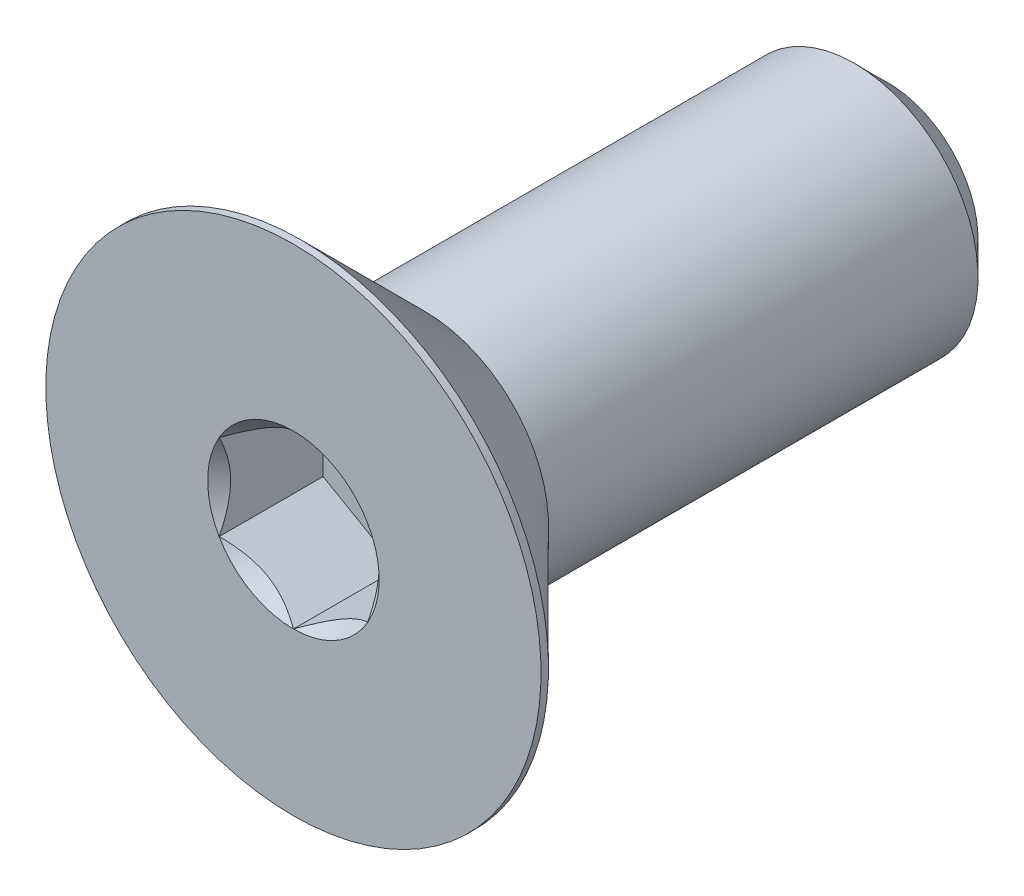
ISO-10303-21;
HEADER;
FILE_DESCRIPTION(('STEP AP214'),'2;1');
FILE_NAME('part.step','',(''),(''),'','','');
FILE_SCHEMA(('AUTOMOTIVE_DESIGN { 1 0 10303 214 1 1 1 1 }'));
ENDSEC;
DATA;
#1=APPLICATION_CONTEXT('core data for automotive mechanical design processes');
#2=APPLICATION_PROTOCOL_DEFINITION('international standard','automotive_design',2000,#1);
#3=PRODUCT_CONTEXT('',#1,'mechanical');
#4=PRODUCT('Part','Part','',(#3));
#5=PRODUCT_RELATED_PRODUCT_CATEGORY('part','',(#4));
#6=PRODUCT_DEFINITION_FORMATION('','',#4);
#7=PRODUCT_DEFINITION_CONTEXT('part definition',#1,'design');
#8=PRODUCT_DEFINITION('design','',#6,#7);
#9=PRODUCT_DEFINITION_SHAPE('','',#8);
#10=(LENGTH_UNIT() NAMED_UNIT(*) SI_UNIT(.MILLI.,.METRE.));
#11=(NAMED_UNIT(*) PLANE_ANGLE_UNIT() SI_UNIT($,.RADIAN.));
#12=(NAMED_UNIT(*) SI_UNIT($,.STERADIAN.) SOLID_ANGLE_UNIT());
#13=UNCERTAINTY_MEASURE_WITH_UNIT(LENGTH_MEASURE(1.E-05),#10,'distance_accuracy_value','');
#14=(GEOMETRIC_REPRESENTATION_CONTEXT(3) GLOBAL_UNCERTAINTY_ASSIGNED_CONTEXT((#13)) GLOBAL_UNIT_ASSIGNED_CONTEXT((#10,
#11,#12)) REPRESENTATION_CONTEXT('',''));
#15=CARTESIAN_POINT('',(0.,0.,0.));
#16=DIRECTION('',(0.,0.,1.));
#17=DIRECTION('',(1.,0.,0.));
#18=AXIS2_PLACEMENT_3D('',#15,#16,#17);
#19=CARTESIAN_POINT('',(0.,0.,3.));
#20=DIRECTION('',(0.,0.,-1.));
#21=DIRECTION('',(0.,1.,0.));
#22=AXIS2_PLACEMENT_3D('',#19,#20,#21);
#23=PLANE('',#22);
#24=CARTESIAN_POINT('',(0.,0.,3.));
#25=DIRECTION('',(0.,0.,1.));
#26=DIRECTION('',(0.,-1.,0.));
#27=AXIS2_PLACEMENT_3D('',#24,#25,#26);
#28=CIRCLE('',#27,2.5);
#29=CARTESIAN_POINT('',(0.,-2.5,3.));
#30=VERTEX_POINT('',#29);
#31=EDGE_CURVE('E225',#30,#30,#28,.T.);
#32=ORIENTED_EDGE('',*,*,#31,.T.);
#33=EDGE_LOOP('',(#32));
#34=FACE_BOUND('',#33,.T.);
#35=CARTESIAN_POINT('',(0.,0.,3.));
#36=DIRECTION('',(0.,0.,-1.));
#37=DIRECTION('',(-1.,0.,0.));
#38=AXIS2_PLACEMENT_3D('',#35,#36,#37);
#39=CIRCLE('',#38,0.86602540378444);
#40=CARTESIAN_POINT('',(-0.750000000000004,0.433012701892216,3.));
#41=VERTEX_POINT('',#40);
#42=CARTESIAN_POINT('',(0.,0.866025403784441,3.));
#43=VERTEX_POINT('',#42);
#44=EDGE_CURVE('E139',#41,#43,#39,.T.);
#45=ORIENTED_EDGE('',*,*,#44,.T.);
#46=CARTESIAN_POINT('',(0.750000000000002,0.433012701892218,3.));
#47=VERTEX_POINT('',#46);
#48=EDGE_CURVE('E138',#43,#47,#39,.T.);
#49=ORIENTED_EDGE('',*,*,#48,.T.);
#50=CARTESIAN_POINT('',(0.750000000000002,-0.43301270189222,3.));
#51=VERTEX_POINT('',#50);
#52=EDGE_CURVE('E110',#47,#51,#39,.T.);
#53=ORIENTED_EDGE('',*,*,#52,.T.);
#54=CARTESIAN_POINT('',(0.,-0.86602540378444,3.));
#55=VERTEX_POINT('',#54);
#56=EDGE_CURVE('E103',#51,#55,#39,.T.);
#57=ORIENTED_EDGE('',*,*,#56,.T.);
#58=CARTESIAN_POINT('',(-0.750000000000001,-0.433012701892221,3.));
#59=VERTEX_POINT('',#58);
#60=EDGE_CURVE('E64',#55,#59,#39,.T.);
#61=ORIENTED_EDGE('',*,*,#60,.T.);
#62=EDGE_CURVE('E71',#59,#41,#39,.T.);
#63=ORIENTED_EDGE('',*,*,#62,.T.);
#64=EDGE_LOOP('',(#45,#49,#53,#57,#61,#63));
#65=FACE_BOUND('',#64,.T.);
#66=ADVANCED_FACE('F44',(#34,#65),#23,.F.);
#67=CARTESIAN_POINT('',(0.,0.,2.925));
#68=DIRECTION('',(0.,0.,1.));
#69=DIRECTION('',(0.,-1.,0.));
#70=AXIS2_PLACEMENT_3D('',#67,#68,#69);
#71=CONICAL_SURFACE('',#70,2.5,0.785398163397448);
#72=CARTESIAN_POINT('',(0.,0.,1.5));
#73=DIRECTION('',(0.,0.,1.));
#74=DIRECTION('',(0.,-1.,0.));
#75=AXIS2_PLACEMENT_3D('',#72,#73,#74);
#76=CIRCLE('',#75,1.075);
#77=CARTESIAN_POINT('',(0.,-1.075,1.5));
#78=VERTEX_POINT('',#77);
#79=EDGE_CURVE('E226',#78,#78,#76,.T.);
#80=ORIENTED_EDGE('',*,*,#79,.T.);
#81=EDGE_LOOP('',(#80));
#82=FACE_BOUND('',#81,.T.);
#83=CARTESIAN_POINT('',(0.,0.,2.925));
#84=DIRECTION('',(0.,0.,1.));
#85=DIRECTION('',(0.,-1.,0.));
#86=AXIS2_PLACEMENT_3D('',#83,#84,#85);
#87=CIRCLE('',#86,2.5);
#88=CARTESIAN_POINT('',(0.,-2.5,2.925));
#89=VERTEX_POINT('',#88);
#90=EDGE_CURVE('E58',#89,#89,#87,.T.);
#91=ORIENTED_EDGE('',*,*,#90,.F.);
#92=EDGE_LOOP('',(#91));
#93=FACE_BOUND('',#92,.T.);
#94=ADVANCED_FACE('F46',(#82,#93),#71,.T.);
#95=CARTESIAN_POINT('',(0.,0.,3.));
#96=DIRECTION('',(0.,0.,1.));
#97=DIRECTION('',(0.,-1.,0.));
#98=AXIS2_PLACEMENT_3D('',#95,#96,#97);
#99=CYLINDRICAL_SURFACE('',#98,2.5);
#100=ORIENTED_EDGE('',*,*,#90,.T.);
#101=EDGE_LOOP('',(#100));
#102=FACE_BOUND('',#101,.T.);
#103=ORIENTED_EDGE('',*,*,#31,.F.);
#104=EDGE_LOOP('',(#103));
#105=FACE_BOUND('',#104,.T.);
#106=ADVANCED_FACE('F210',(#102,#105),#99,.T.);
#107=CARTESIAN_POINT('',(0.,0.,1.5));
#108=DIRECTION('',(0.,0.,-1.));
#109=DIRECTION('',(0.,1.,0.));
#110=AXIS2_PLACEMENT_3D('',#107,#108,#109);
#111=PLANE('',#110);
#112=ORIENTED_EDGE('',*,*,#79,.F.);
#113=EDGE_LOOP('',(#112));
#114=FACE_BOUND('',#113,.T.);
#115=ADVANCED_FACE('F214',(#114),#111,.T.);
#116=CARTESIAN_POINT('',(0.,0.,3.));
#117=DIRECTION('',(0.,0.,1.));
#118=DIRECTION('',(-1.,0.,0.));
#119=AXIS2_PLACEMENT_3D('',#116,#117,#118);
#120=CONICAL_SURFACE('',#119,0.86602540378444,0.78539816339745);
#121=CARTESIAN_POINT('',(0.750000000000002,-0.863604064848466,3.2777892581354));
#122=CARTESIAN_POINT('',(0.750000000000002,-0.842575879734336,3.26191493200842));
#123=CARTESIAN_POINT('',(0.750000000000002,-0.821430496291564,3.24619626518301));
#124=CARTESIAN_POINT('',(0.750000000000002,-0.778857857419023,3.21513452062663));
#125=CARTESIAN_POINT('',(0.750000000000002,-0.757430533042239,3.19979153749356));
#126=CARTESIAN_POINT('',(0.750000000000002,-0.692340710712938,3.15420358029367));
#127=CARTESIAN_POINT('',(0.750000000000002,-0.648190081053416,3.12464409174343));
#128=CARTESIAN_POINT('',(0.750000000000002,-0.555607181501752,3.0666155826928));
#129=CARTESIAN_POINT('',(0.750000000000002,-0.507074363017998,3.0383051093658));
#130=CARTESIAN_POINT('',(0.750000000000002,-0.407587529772338,2.98651811176889));
#131=CARTESIAN_POINT('',(0.750000000000002,-0.356642419548472,2.96302529153186));
#132=CARTESIAN_POINT('',(0.750000000000002,-0.280165468820771,2.93428689950068));
#133=CARTESIAN_POINT('',(0.750000000000002,-0.255770023930572,2.92603927481306));
#134=CARTESIAN_POINT('',(0.750000000000002,-0.206403277885132,2.91149717542019));
#135=CARTESIAN_POINT('',(0.750000000000002,-0.181431937185907,2.90520283526912));
#136=CARTESIAN_POINT('',(0.750000000000002,-0.106699879404925,2.8899931738806));
#137=CARTESIAN_POINT('',(0.750000000000002,-0.0561907171762175,2.8843771847129));
#138=CARTESIAN_POINT('',(0.750000000000002,0.0430767231749065,2.88362825645436));
#139=CARTESIAN_POINT('',(0.750000000000002,0.0918322434166289,2.88812345140562));
#140=CARTESIAN_POINT('',(0.750000000000002,0.164112195698295,2.90133730744599));
#141=CARTESIAN_POINT('',(0.750000000000002,0.188278676879437,2.90690144638208));
#142=CARTESIAN_POINT('',(0.750000000000002,0.236094480120332,2.91992316614873));
#143=CARTESIAN_POINT('',(0.750000000000002,0.259743845273042,2.92738058854766));
#144=CARTESIAN_POINT('',(0.750000000000002,0.33419827846382,2.95366646946609));
#145=CARTESIAN_POINT('',(0.750000000000002,0.383940060445496,2.97549033804845));
#146=CARTESIAN_POINT('',(0.750000000000002,0.481089225076667,3.02401180410059));
#147=CARTESIAN_POINT('',(0.750000000000002,0.528487417973018,3.05072691131036));
#148=CARTESIAN_POINT('',(0.750000000000002,0.619071540465252,3.10584285115078));
#149=CARTESIAN_POINT('',(0.750000000000002,0.66234974530024,3.13409394545219));
#150=CARTESIAN_POINT('',(0.750000000000002,0.726111623216226,3.17776714709751));
#151=CARTESIAN_POINT('',(0.750000000000002,0.747090419255282,3.19247886051671));
#152=CARTESIAN_POINT('',(0.750000000000002,0.788761341501862,3.2222913841024));
#153=CARTESIAN_POINT('',(0.750000000000002,0.809453544535621,3.23739208676303));
#154=CARTESIAN_POINT('',(0.750000000000002,0.830026390097471,3.25265408930473));
#155=B_SPLINE_CURVE_WITH_KNOTS('',3,(#121,#122,#123,#124,#125,#126,#127,#128,#129,#130,#131,
#132,#133,#134,#135,#136,#137,#138,#139,#140,#141,#142,#143,#144,#145,#146,#147,#148,#149,#150,
#151,#152,#153,#154),.UNSPECIFIED.,.F.,.F.,(4,2,2,2,2,2,2,2,2,2,2,2,2,2,2,2,4),(0.,
0.0790398443124683,0.158099390497594,0.317425208674103,0.48584515568138,0.65368565830396,
0.730869805636069,0.808059268704012,0.959469653380784,1.1054029044749,1.17973203111654,
1.25405493988072,1.41653726506054,1.57961304287543,1.73458511695816,1.81145152932467,
1.88829692115811),.UNSPECIFIED.);
#156=EDGE_CURVE('E12',#47,#51,#155,.F.);
#157=ORIENTED_EDGE('',*,*,#156,.T.);
#158=ORIENTED_EDGE('',*,*,#52,.F.);
#159=EDGE_LOOP('',(#157,#158));
#160=FACE_BOUND('',#159,.T.);
#161=ADVANCED_FACE('F115',(#160),#120,.F.);
#162=CARTESIAN_POINT('',(-0.000199999999999349,0.866140873838276,3.00011549314477));
#163=CARTESIAN_POINT('',(0.0255899625576821,0.851251032013208,2.98523411046392));
#164=CARTESIAN_POINT('',(0.0518112021286598,0.836112192288419,2.97122626560696));
#165=CARTESIAN_POINT('',(0.105279708235707,0.805242135894348,2.94557752468226));
#166=CARTESIAN_POINT('',(0.132532067460573,0.789507978959819,2.93395091170567));
#167=CARTESIAN_POINT('',(0.187485350381354,0.757780686272653,2.91403404577224));
#168=CARTESIAN_POINT('',(0.21517225669551,0.741795643459147,2.90569369408137));
#169=CARTESIAN_POINT('',(0.271155595130853,0.709473647943367,2.89284274196143));
#170=CARTESIAN_POINT('',(0.299450314843645,0.693137683900542,2.88832254058884));
#171=CARTESIAN_POINT('',(0.348210289268843,0.664986099540475,2.88424583309744));
#172=CARTESIAN_POINT('',(0.368612065655573,0.65320712845165,2.88364279661408));
#173=CARTESIAN_POINT('',(0.40937613469636,0.629671982217687,2.88465450601553));
#174=CARTESIAN_POINT('',(0.429738417651455,0.617915812672247,2.88626974099003));
#175=CARTESIAN_POINT('',(0.490534543086824,0.582815153286451,2.89433614697304));
#176=CARTESIAN_POINT('',(0.530665854996099,0.559645329552698,2.90400893582772));
#177=CARTESIAN_POINT('',(0.601110400354026,0.518974152327358,2.92735631797232));
#178=CARTESIAN_POINT('',(0.631753572009087,0.501282308923485,2.93980855807225));
#179=CARTESIAN_POINT('',(0.691839345804792,0.466591771248068,2.96785961023086));
#180=CARTESIAN_POINT('',(0.721285488381593,0.449591032904756,2.98344818590375));
#181=CARTESIAN_POINT('',(0.750200000000002,0.432897231838381,3.00011549314477));
#182=B_SPLINE_CURVE_WITH_KNOTS('',3,(#162,#163,#164,#165,#166,#167,#168,#169,#170,#171,#172,
#173,#174,#175,#176,#177,#178,#179,#180,#181),.UNSPECIFIED.,.F.,.F.,(4,2,2,2,2,2,2,2,2,4),(0.,
0.0999419466095597,0.200466857654446,0.299393763705717,0.398071297300229,0.468665775681747,
0.539275821398838,0.680536257244566,0.792918418368074,0.904939568716033),.UNSPECIFIED.);
#183=EDGE_CURVE('E141',#43,#47,#182,.T.);
#184=ORIENTED_EDGE('',*,*,#183,.T.);
#185=ORIENTED_EDGE('',*,*,#48,.F.);
#186=EDGE_LOOP('',(#184,#185));
#187=FACE_BOUND('',#186,.T.);
#188=ADVANCED_FACE('F264',(#187),#120,.F.);
#189=CARTESIAN_POINT('',(-0.750200000000001,0.43289723183838,3.00011549314477));
#190=CARTESIAN_POINT('',(-0.72441003744232,0.447787073663448,2.98523411046392));
#191=CARTESIAN_POINT('',(-0.698188797871342,0.462925913388238,2.97122626560696));
#192=CARTESIAN_POINT('',(-0.644720291764295,0.493795969782308,2.94557752468226));
#193=CARTESIAN_POINT('',(-0.617467932539428,0.509530126716837,2.93395091170567));
#194=CARTESIAN_POINT('',(-0.562514649618647,0.541257419404004,2.91403404577224));
#195=CARTESIAN_POINT('',(-0.534827743304491,0.55724246221751,2.90569369408137));
#196=CARTESIAN_POINT('',(-0.478844404869147,0.58956445773329,2.89284274196143));
#197=CARTESIAN_POINT('',(-0.450549685156355,0.605900421776115,2.88832254058884));
#198=CARTESIAN_POINT('',(-0.401789710731156,0.634052006136183,2.88424583309744));
#199=CARTESIAN_POINT('',(-0.381387934344427,0.645830977225008,2.88364279661408));
#200=CARTESIAN_POINT('',(-0.34062386530364,0.669366123458971,2.88465450601553));
#201=CARTESIAN_POINT('',(-0.320261582348545,0.68112229300441,2.88626974099003));
#202=CARTESIAN_POINT('',(-0.259465456913176,0.716222952390207,2.89433614697304));
#203=CARTESIAN_POINT('',(-0.219334145003901,0.739392776123959,2.90400893582772));
#204=CARTESIAN_POINT('',(-0.148889599645974,0.780063953349299,2.92735631797231));
#205=CARTESIAN_POINT('',(-0.118246427990913,0.797755796753172,2.93980855807225));
#206=CARTESIAN_POINT('',(-0.0581606541952098,0.832446334428589,2.96785961023086));
#207=CARTESIAN_POINT('',(-0.0287145116184087,0.849447072771901,2.98344818590375));
#208=CARTESIAN_POINT('',(0.000200000000000623,0.866140873838276,3.00011549314477));
#209=B_SPLINE_CURVE_WITH_KNOTS('',3,(#189,#190,#191,#192,#193,#194,#195,#196,#197,#198,#199,
#200,#201,#202,#203,#204,#205,#206,#207,#208),.UNSPECIFIED.,.F.,.F.,(4,2,2,2,2,2,2,2,2,4),(0.,
0.0999419466095599,0.200466857654447,0.299393763705719,0.398071297300232,0.46866577568175,
0.539275821398841,0.680536257244568,0.792918418368076,0.904939568716034),.UNSPECIFIED.);
#210=EDGE_CURVE('E148',#41,#43,#209,.T.);
#211=ORIENTED_EDGE('',*,*,#210,.T.);
#212=ORIENTED_EDGE('',*,*,#44,.F.);
#213=EDGE_LOOP('',(#211,#212));
#214=FACE_BOUND('',#213,.T.);
#215=ADVANCED_FACE('F260',(#214),#120,.F.);
#216=CARTESIAN_POINT('',(-0.750000000000001,-0.863604064848469,3.2777892581354));
#217=CARTESIAN_POINT('',(-0.750000000000001,-0.842575879734339,3.26191493200842));
#218=CARTESIAN_POINT('',(-0.750000000000001,-0.821430496291567,3.24619626518301));
#219=CARTESIAN_POINT('',(-0.750000000000001,-0.778857857419025,3.21513452062663));
#220=CARTESIAN_POINT('',(-0.750000000000001,-0.757430533042242,3.19979153749356));
#221=CARTESIAN_POINT('',(-0.750000000000001,-0.692340710712941,3.15420358029367));
#222=CARTESIAN_POINT('',(-0.750000000000001,-0.648190081053418,3.12464409174344));
#223=CARTESIAN_POINT('',(-0.750000000000001,-0.555607181501755,3.0666155826928));
#224=CARTESIAN_POINT('',(-0.750000000000001,-0.507074363018,3.0383051093658));
#225=CARTESIAN_POINT('',(-0.750000000000001,-0.40758752977234,2.98651811176889));
#226=CARTESIAN_POINT('',(-0.750000000000001,-0.356642419548473,2.96302529153186));
#227=CARTESIAN_POINT('',(-0.750000000000001,-0.280165468820773,2.93428689950068));
#228=CARTESIAN_POINT('',(-0.750000000000001,-0.255770023930574,2.92603927481306));
#229=CARTESIAN_POINT('',(-0.750000000000001,-0.206403277885133,2.91149717542019));
#230=CARTESIAN_POINT('',(-0.750000000000001,-0.181431937185909,2.90520283526912));
#231=CARTESIAN_POINT('',(-0.750000000000001,-0.106699879404926,2.8899931738806));
#232=CARTESIAN_POINT('',(-0.750000000000001,-0.0561907171762188,2.8843771847129));
#233=CARTESIAN_POINT('',(-0.750000000000001,0.0430767231749053,2.88362825645436));
#234=CARTESIAN_POINT('',(-0.750000000000001,0.0918322434166278,2.88812345140562));
#235=CARTESIAN_POINT('',(-0.750000000000001,0.164112195698294,2.90133730744599));
#236=CARTESIAN_POINT('',(-0.750000000000001,0.188278676879436,2.90690144638208));
#237=CARTESIAN_POINT('',(-0.750000000000001,0.236094480120331,2.91992316614873));
#238=CARTESIAN_POINT('',(-0.750000000000001,0.259743845273041,2.92738058854766));
#239=CARTESIAN_POINT('',(-0.750000000000001,0.33419827846382,2.95366646946609));
#240=CARTESIAN_POINT('',(-0.750000000000001,0.383940060445496,2.97549033804845));
#241=CARTESIAN_POINT('',(-0.750000000000001,0.481089225076667,3.02401180410059));
#242=CARTESIAN_POINT('',(-0.750000000000001,0.528487417973018,3.05072691131035));
#243=CARTESIAN_POINT('',(-0.750000000000001,0.619071540465252,3.10584285115078));
#244=CARTESIAN_POINT('',(-0.750000000000001,0.66234974530024,3.13409394545219));
#245=CARTESIAN_POINT('',(-0.750000000000001,0.726111623216225,3.17776714709751));
#246=CARTESIAN_POINT('',(-0.750000000000001,0.747090419255281,3.1924788605167));
#247=CARTESIAN_POINT('',(-0.750000000000001,0.788761341501861,3.2222913841024));
#248=CARTESIAN_POINT('',(-0.750000000000001,0.80945354453562,3.23739208676303));
#249=CARTESIAN_POINT('',(-0.750000000000001,0.83002639009747,3.25265408930473));
#250=B_SPLINE_CURVE_WITH_KNOTS('',3,(#216,#217,#218,#219,#220,#221,#222,#223,#224,#225,#226,
#227,#228,#229,#230,#231,#232,#233,#234,#235,#236,#237,#238,#239,#240,#241,#242,#243,#244,#245,
#246,#247,#248,#249),.UNSPECIFIED.,.F.,.F.,(4,2,2,2,2,2,2,2,2,2,2,2,2,2,2,2,4),(0.,
0.0790398443124683,0.158099390497595,0.317425208674104,0.485845155681381,0.653685658303962,
0.730869805636071,0.808059268704015,0.959469653380787,1.1054029044749,1.17973203111654,
1.25405493988073,1.41653726506054,1.57961304287544,1.73458511695817,1.81145152932467,
1.88829692115811),.UNSPECIFIED.);
#251=EDGE_CURVE('E168',#59,#41,#250,.T.);
#252=ORIENTED_EDGE('',*,*,#251,.T.);
#253=ORIENTED_EDGE('',*,*,#62,.F.);
#254=EDGE_LOOP('',(#252,#253));
#255=FACE_BOUND('',#254,.T.);
#256=ADVANCED_FACE('F269',(#255),#120,.F.);
#257=CARTESIAN_POINT('',(0.000199999999999101,-0.86614087383828,3.00011549314477));
#258=CARTESIAN_POINT('',(-0.0255899625576824,-0.851251032013212,2.98523411046393));
#259=CARTESIAN_POINT('',(-0.0518112021286602,-0.836112192288423,2.97122626560696));
#260=CARTESIAN_POINT('',(-0.105279708235707,-0.805242135894352,2.94557752468226));
#261=CARTESIAN_POINT('',(-0.132532067460574,-0.789507978959823,2.93395091170567));
#262=CARTESIAN_POINT('',(-0.187485350381354,-0.757780686272656,2.91403404577225));
#263=CARTESIAN_POINT('',(-0.215172256695511,-0.74179564345915,2.90569369408138));
#264=CARTESIAN_POINT('',(-0.271155595130855,-0.70947364794337,2.89284274196143));
#265=CARTESIAN_POINT('',(-0.299450314843647,-0.693137683900545,2.88832254058884));
#266=CARTESIAN_POINT('',(-0.348210289268845,-0.664986099540477,2.88424583309744));
#267=CARTESIAN_POINT('',(-0.368612065655574,-0.653207128451653,2.88364279661408));
#268=CARTESIAN_POINT('',(-0.409376134696362,-0.629671982217689,2.88465450601553));
#269=CARTESIAN_POINT('',(-0.429738417651457,-0.61791581267225,2.88626974099004));
#270=CARTESIAN_POINT('',(-0.490534543086826,-0.582815153286453,2.89433614697304));
#271=CARTESIAN_POINT('',(-0.530665854996102,-0.5596453295527,2.90400893582772));
#272=CARTESIAN_POINT('',(-0.601110400354028,-0.518974152327361,2.92735631797232));
#273=CARTESIAN_POINT('',(-0.631753572009089,-0.501282308923487,2.93980855807226));
#274=CARTESIAN_POINT('',(-0.691839345804792,-0.466591771248071,2.96785961023086));
#275=CARTESIAN_POINT('',(-0.721285488381592,-0.44959103290476,2.98344818590375));
#276=CARTESIAN_POINT('',(-0.750200000000001,-0.432897231838385,3.00011549314477));
#277=B_SPLINE_CURVE_WITH_KNOTS('',3,(#257,#258,#259,#260,#261,#262,#263,#264,#265,#266,#267,
#268,#269,#270,#271,#272,#273,#274,#275,#276),.UNSPECIFIED.,.F.,.F.,(4,2,2,2,2,2,2,2,2,4),(0.,
0.0999419466095598,0.200466857654447,0.299393763705718,0.398071297300231,0.468665775681749,
0.539275821398841,0.680536257244569,0.792918418368075,0.904939568716032),.UNSPECIFIED.);
#278=EDGE_CURVE('E127',#55,#59,#277,.T.);
#279=ORIENTED_EDGE('',*,*,#278,.T.);
#280=ORIENTED_EDGE('',*,*,#60,.F.);
#281=EDGE_LOOP('',(#279,#280));
#282=FACE_BOUND('',#281,.T.);
#283=ADVANCED_FACE('F161',(#282),#120,.F.);
#284=CARTESIAN_POINT('',(0.750200000000002,-0.432897231838383,3.00011549314477));
#285=CARTESIAN_POINT('',(0.72441003744232,-0.447787073663451,2.98523411046393));
#286=CARTESIAN_POINT('',(0.698188797871343,-0.462925913388241,2.97122626560696));
#287=CARTESIAN_POINT('',(0.644720291764295,-0.493795969782311,2.94557752468226));
#288=CARTESIAN_POINT('',(0.617467932539429,-0.509530126716841,2.93395091170567));
#289=CARTESIAN_POINT('',(0.562514649618648,-0.541257419404007,2.91403404577225));
#290=CARTESIAN_POINT('',(0.534827743304492,-0.557242462217513,2.90569369408137));
#291=CARTESIAN_POINT('',(0.478844404869148,-0.589564457733292,2.89284274196143));
#292=CARTESIAN_POINT('',(0.450549685156356,-0.605900421776118,2.88832254058884));
#293=CARTESIAN_POINT('',(0.401789710731158,-0.634052006136186,2.88424583309744));
#294=CARTESIAN_POINT('',(0.381387934344429,-0.64583097722501,2.88364279661408));
#295=CARTESIAN_POINT('',(0.340623865303641,-0.669366123458974,2.88465450601553));
#296=CARTESIAN_POINT('',(0.320261582348546,-0.681122293004413,2.88626974099004));
#297=CARTESIAN_POINT('',(0.259465456913177,-0.716222952390209,2.89433614697304));
#298=CARTESIAN_POINT('',(0.219334145003902,-0.739392776123963,2.90400893582772));
#299=CARTESIAN_POINT('',(0.148889599645975,-0.780063953349303,2.92735631797232));
#300=CARTESIAN_POINT('',(0.118246427990914,-0.797755796753176,2.93980855807226));
#301=CARTESIAN_POINT('',(0.0581606541952097,-0.832446334428593,2.96785961023086));
#302=CARTESIAN_POINT('',(0.0287145116184085,-0.849447072771905,2.98344818590375));
#303=CARTESIAN_POINT('',(-0.000200000000000878,-0.86614087383828,3.00011549314477));
#304=B_SPLINE_CURVE_WITH_KNOTS('',3,(#284,#285,#286,#287,#288,#289,#290,#291,#292,#293,#294,
#295,#296,#297,#298,#299,#300,#301,#302,#303),.UNSPECIFIED.,.F.,.F.,(4,2,2,2,2,2,2,2,2,4),(0.,
0.0999419466095597,0.200466857654446,0.299393763705718,0.398071297300231,0.468665775681749,
0.53927582139884,0.680536257244568,0.792918418368077,0.904939568716035),.UNSPECIFIED.);
#305=EDGE_CURVE('E106',#51,#55,#304,.T.);
#306=ORIENTED_EDGE('',*,*,#305,.T.);
#307=ORIENTED_EDGE('',*,*,#56,.F.);
#308=EDGE_LOOP('',(#306,#307));
#309=FACE_BOUND('',#308,.T.);
#310=ADVANCED_FACE('F104',(#309),#120,.F.);
#311=CARTESIAN_POINT('',(0.750000000000002,-0.433012701892221,1.95));
#312=DIRECTION('',(0.,0.,1.));
#313=DIRECTION('',(1.,0.,0.));
#314=AXIS2_PLACEMENT_3D('',#311,#312,#313);
#315=PLANE('',#314);
#316=DIRECTION('',(0.866025403784439,0.5,0.));
#317=VECTOR('',#316,1.);
#318=CARTESIAN_POINT('',(0.,-0.866025403784442,1.95));
#319=LINE('',#318,#317);
#320=CARTESIAN_POINT('',(0.,-0.866025403784442,1.95));
#321=VERTEX_POINT('',#320);
#322=CARTESIAN_POINT('',(0.750000000000002,-0.433012701892221,1.95));
#323=VERTEX_POINT('',#322);
#324=EDGE_CURVE('E126',#321,#323,#319,.T.);
#325=ORIENTED_EDGE('',*,*,#324,.T.);
#326=DIRECTION('',(0.,1.,0.));
#327=VECTOR('',#326,1.);
#328=CARTESIAN_POINT('',(0.750000000000002,-0.433012701892221,1.95));
#329=LINE('',#328,#327);
#330=CARTESIAN_POINT('',(0.750000000000002,0.433012701892218,1.95));
#331=VERTEX_POINT('',#330);
#332=EDGE_CURVE('E131',#323,#331,#329,.T.);
#333=ORIENTED_EDGE('',*,*,#332,.T.);
#334=DIRECTION('',(-0.866025403784439,0.5,0.));
#335=VECTOR('',#334,1.);
#336=CARTESIAN_POINT('',(0.750000000000002,0.433012701892218,1.95));
#337=LINE('',#336,#335);
#338=CARTESIAN_POINT('',(0.,0.866025403784438,1.95));
#339=VERTEX_POINT('',#338);
#340=EDGE_CURVE('E250',#331,#339,#337,.T.);
#341=ORIENTED_EDGE('',*,*,#340,.T.);
#342=DIRECTION('',(-0.866025403784439,-0.5,0.));
#343=VECTOR('',#342,1.);
#344=CARTESIAN_POINT('',(0.,0.866025403784438,1.95));
#345=LINE('',#344,#343);
#346=CARTESIAN_POINT('',(-0.750000000000001,0.433012701892218,1.95));
#347=VERTEX_POINT('',#346);
#348=EDGE_CURVE('E247',#339,#347,#345,.T.);
#349=ORIENTED_EDGE('',*,*,#348,.T.);
#350=DIRECTION('',(0.,-1.,0.));
#351=VECTOR('',#350,1.);
#352=CARTESIAN_POINT('',(-0.750000000000001,0.433012701892218,1.95));
#353=LINE('',#352,#351);
#354=CARTESIAN_POINT('',(-0.750000000000001,-0.433012701892223,1.95));
#355=VERTEX_POINT('',#354);
#356=EDGE_CURVE('E244',#347,#355,#353,.T.);
#357=ORIENTED_EDGE('',*,*,#356,.T.);
#358=DIRECTION('',(0.866025403784438,-0.5,0.));
#359=VECTOR('',#358,1.);
#360=CARTESIAN_POINT('',(-0.750000000000001,-0.433012701892223,1.95));
#361=LINE('',#360,#359);
#362=EDGE_CURVE('E134',#355,#321,#361,.T.);
#363=ORIENTED_EDGE('',*,*,#362,.T.);
#364=EDGE_LOOP('',(#325,#333,#341,#349,#357,#363));
#365=FACE_BOUND('',#364,.T.);
#366=ADVANCED_FACE('F160',(#365),#315,.T.);
#367=CARTESIAN_POINT('',(0.750000000000002,-0.433012701892221,1.95));
#368=DIRECTION('',(1.,0.,0.));
#369=DIRECTION('',(0.,1.,0.));
#370=AXIS2_PLACEMENT_3D('',#367,#368,#369);
#371=PLANE('',#370);
#372=ORIENTED_EDGE('',*,*,#156,.F.);
#373=DIRECTION('',(0.,0.,1.));
#374=VECTOR('',#373,1.);
#375=CARTESIAN_POINT('',(0.750000000000002,0.433012701892218,1.95));
#376=LINE('',#375,#374);
#377=EDGE_CURVE('E133',#331,#47,#376,.T.);
#378=ORIENTED_EDGE('',*,*,#377,.F.);
#379=ORIENTED_EDGE('',*,*,#332,.F.);
#380=DIRECTION('',(0.,0.,1.));
#381=VECTOR('',#380,1.);
#382=CARTESIAN_POINT('',(0.750000000000002,-0.433012701892221,1.95));
#383=LINE('',#382,#381);
#384=EDGE_CURVE('E123',#323,#51,#383,.T.);
#385=ORIENTED_EDGE('',*,*,#384,.T.);
#386=EDGE_LOOP('',(#372,#378,#379,#385));
#387=FACE_BOUND('',#386,.T.);
#388=ADVANCED_FACE('F129',(#387),#371,.F.);
#389=CARTESIAN_POINT('',(0.750000000000002,0.433012701892218,1.95));
#390=DIRECTION('',(0.5,0.866025403784439,0.));
#391=DIRECTION('',(-0.866025403784439,0.5,0.));
#392=AXIS2_PLACEMENT_3D('',#389,#390,#391);
#393=PLANE('',#392);
#394=ORIENTED_EDGE('',*,*,#183,.F.);
#395=DIRECTION('',(0.,0.,1.));
#396=VECTOR('',#395,1.);
#397=CARTESIAN_POINT('',(0.,0.866025403784438,1.95));
#398=LINE('',#397,#396);
#399=EDGE_CURVE('E232',#339,#43,#398,.T.);
#400=ORIENTED_EDGE('',*,*,#399,.F.);
#401=ORIENTED_EDGE('',*,*,#340,.F.);
#402=ORIENTED_EDGE('',*,*,#377,.T.);
#403=EDGE_LOOP('',(#394,#400,#401,#402));
#404=FACE_BOUND('',#403,.T.);
#405=ADVANCED_FACE('F155',(#404),#393,.F.);
#406=CARTESIAN_POINT('',(0.,0.866025403784438,1.95));
#407=DIRECTION('',(-0.5,0.866025403784439,0.));
#408=DIRECTION('',(-0.866025403784439,-0.5,0.));
#409=AXIS2_PLACEMENT_3D('',#406,#407,#408);
#410=PLANE('',#409);
#411=ORIENTED_EDGE('',*,*,#210,.F.);
#412=DIRECTION('',(0.,0.,1.));
#413=VECTOR('',#412,1.);
#414=CARTESIAN_POINT('',(-0.750000000000001,0.433012701892218,1.95));
#415=LINE('',#414,#413);
#416=EDGE_CURVE('E235',#347,#41,#415,.T.);
#417=ORIENTED_EDGE('',*,*,#416,.F.);
#418=ORIENTED_EDGE('',*,*,#348,.F.);
#419=ORIENTED_EDGE('',*,*,#399,.T.);
#420=EDGE_LOOP('',(#411,#417,#418,#419));
#421=FACE_BOUND('',#420,.T.);
#422=ADVANCED_FACE('F192',(#421),#410,.F.);
#423=CARTESIAN_POINT('',(-0.750000000000001,0.433012701892218,1.95));
#424=DIRECTION('',(-1.,0.,0.));
#425=DIRECTION('',(0.,-1.,0.));
#426=AXIS2_PLACEMENT_3D('',#423,#424,#425);
#427=PLANE('',#426);
#428=ORIENTED_EDGE('',*,*,#251,.F.);
#429=DIRECTION('',(0.,0.,1.));
#430=VECTOR('',#429,1.);
#431=CARTESIAN_POINT('',(-0.750000000000001,-0.433012701892223,1.95));
#432=LINE('',#431,#430);
#433=EDGE_CURVE('E238',#355,#59,#432,.T.);
#434=ORIENTED_EDGE('',*,*,#433,.F.);
#435=ORIENTED_EDGE('',*,*,#356,.F.);
#436=ORIENTED_EDGE('',*,*,#416,.T.);
#437=EDGE_LOOP('',(#428,#434,#435,#436));
#438=FACE_BOUND('',#437,.T.);
#439=ADVANCED_FACE('F188',(#438),#427,.F.);
#440=CARTESIAN_POINT('',(-0.750000000000001,-0.433012701892223,1.95));
#441=DIRECTION('',(-0.5,-0.866025403784439,0.));
#442=DIRECTION('',(0.866025403784439,-0.5,0.));
#443=AXIS2_PLACEMENT_3D('',#440,#441,#442);
#444=PLANE('',#443);
#445=ORIENTED_EDGE('',*,*,#278,.F.);
#446=DIRECTION('',(0.,0.,1.));
#447=VECTOR('',#446,1.);
#448=CARTESIAN_POINT('',(0.,-0.866025403784442,1.95));
#449=LINE('',#448,#447);
#450=EDGE_CURVE('E125',#321,#55,#449,.T.);
#451=ORIENTED_EDGE('',*,*,#450,.F.);
#452=ORIENTED_EDGE('',*,*,#362,.F.);
#453=ORIENTED_EDGE('',*,*,#433,.T.);
#454=EDGE_LOOP('',(#445,#451,#452,#453));
#455=FACE_BOUND('',#454,.T.);
#456=ADVANCED_FACE('F185',(#455),#444,.F.);
#457=CARTESIAN_POINT('',(0.,-0.866025403784442,1.95));
#458=DIRECTION('',(0.5,-0.866025403784439,0.));
#459=DIRECTION('',(0.866025403784439,0.5,0.));
#460=AXIS2_PLACEMENT_3D('',#457,#458,#459);
#461=PLANE('',#460);
#462=ORIENTED_EDGE('',*,*,#305,.F.);
#463=ORIENTED_EDGE('',*,*,#384,.F.);
#464=ORIENTED_EDGE('',*,*,#324,.F.);
#465=ORIENTED_EDGE('',*,*,#450,.T.);
#466=EDGE_LOOP('',(#462,#463,#464,#465));
#467=FACE_BOUND('',#466,.T.);
#468=ADVANCED_FACE('F121',(#467),#461,.F.);
#469=CLOSED_SHELL('',(#66,#94,#106,#115,#161,#188,#215,#256,#283,#310,#366,#388,#405,#422,#439,
#456,#468));
#470=MANIFOLD_SOLID_BREP('B2',#469);
#471=CARTESIAN_POINT('',(0.,-1.25000000000001,1.95000000000001));
#472=DIRECTION('',(0.,0.,-1.));
#473=DIRECTION('',(0.,1.,0.));
#474=AXIS2_PLACEMENT_3D('',#471,#472,#473);
#475=PLANE('',#474);
#476=CARTESIAN_POINT('',(0.,0.,1.95000000000001));
#477=DIRECTION('',(0.,0.,1.));
#478=DIRECTION('',(0.,-1.,0.));
#479=AXIS2_PLACEMENT_3D('',#476,#477,#478);
#480=CIRCLE('',#479,1.25000000000001);
#481=CARTESIAN_POINT('',(0.,-1.25000000000001,1.95000000000001));
#482=VERTEX_POINT('',#481);
#483=EDGE_CURVE('E351',#482,#482,#480,.T.);
#484=ORIENTED_EDGE('',*,*,#483,.T.);
#485=EDGE_LOOP('',(#484));
#486=FACE_BOUND('',#485,.T.);
#487=ADVANCED_FACE('F340',(#486),#475,.F.);
#488=CARTESIAN_POINT('',(0.,-1.25,-3.00000000000001));
#489=DIRECTION('',(0.,0.,1.));
#490=DIRECTION('',(0.,-1.,0.));
#491=AXIS2_PLACEMENT_3D('',#488,#489,#490);
#492=PLANE('',#491);
#493=CARTESIAN_POINT('',(0.,0.,-3.00000000000001));
#494=DIRECTION('',(0.,0.,1.));
#495=DIRECTION('',(0.,-1.,0.));
#496=AXIS2_PLACEMENT_3D('',#493,#494,#495);
#497=CIRCLE('',#496,0.9125);
#498=CARTESIAN_POINT('',(0.,-0.9125,-3.00000000000001));
#499=VERTEX_POINT('',#498);
#500=EDGE_CURVE('E43',#499,#499,#497,.F.);
#501=ORIENTED_EDGE('',*,*,#500,.T.);
#502=EDGE_LOOP('',(#501));
#503=FACE_BOUND('',#502,.T.);
#504=ADVANCED_FACE('F361',(#503),#492,.F.);
#505=CARTESIAN_POINT('',(0.,0.,1.95));
#506=DIRECTION('',(0.,0.,1.));
#507=DIRECTION('',(0.,-1.,0.));
#508=AXIS2_PLACEMENT_3D('',#505,#506,#507);
#509=CYLINDRICAL_SURFACE('',#508,1.25000000000001);
#510=CARTESIAN_POINT('',(0.,0.,-2.6625));
#511=DIRECTION('',(0.,0.,1.));
#512=DIRECTION('',(0.,-1.,0.));
#513=AXIS2_PLACEMENT_3D('',#510,#511,#512);
#514=CIRCLE('',#513,1.25000000000001);
#515=CARTESIAN_POINT('',(0.,-1.25000000000001,-2.6625));
#516=VERTEX_POINT('',#515);
#517=EDGE_CURVE('E347',#516,#516,#514,.T.);
#518=ORIENTED_EDGE('',*,*,#517,.T.);
#519=EDGE_LOOP('',(#518));
#520=FACE_BOUND('',#519,.T.);
#521=ORIENTED_EDGE('',*,*,#483,.F.);
#522=EDGE_LOOP('',(#521));
#523=FACE_BOUND('',#522,.T.);
#524=ADVANCED_FACE('F359',(#520,#523),#509,.T.);
#525=CARTESIAN_POINT('',(0.,0.,-2.6625));
#526=DIRECTION('',(0.,0.,1.));
#527=DIRECTION('',(0.,-1.,0.));
#528=AXIS2_PLACEMENT_3D('',#525,#526,#527);
#529=CONICAL_SURFACE('',#528,1.25000000000001,0.78539816339745);
#530=ORIENTED_EDGE('',*,*,#500,.F.);
#531=EDGE_LOOP('',(#530));
#532=FACE_BOUND('',#531,.T.);
#533=ORIENTED_EDGE('',*,*,#517,.F.);
#534=EDGE_LOOP('',(#533));
#535=FACE_BOUND('',#534,.T.);
#536=ADVANCED_FACE('F342',(#532,#535),#529,.T.);
#537=CLOSED_SHELL('',(#487,#504,#524,#536));
#538=MANIFOLD_SOLID_BREP('B6',#537);
#539=ADVANCED_BREP_SHAPE_REPRESENTATION('',(#18,#470,#538),#14);
#540=SHAPE_DEFINITION_REPRESENTATION(#9,#539);
ENDSEC;
END-ISO-10303-21;
